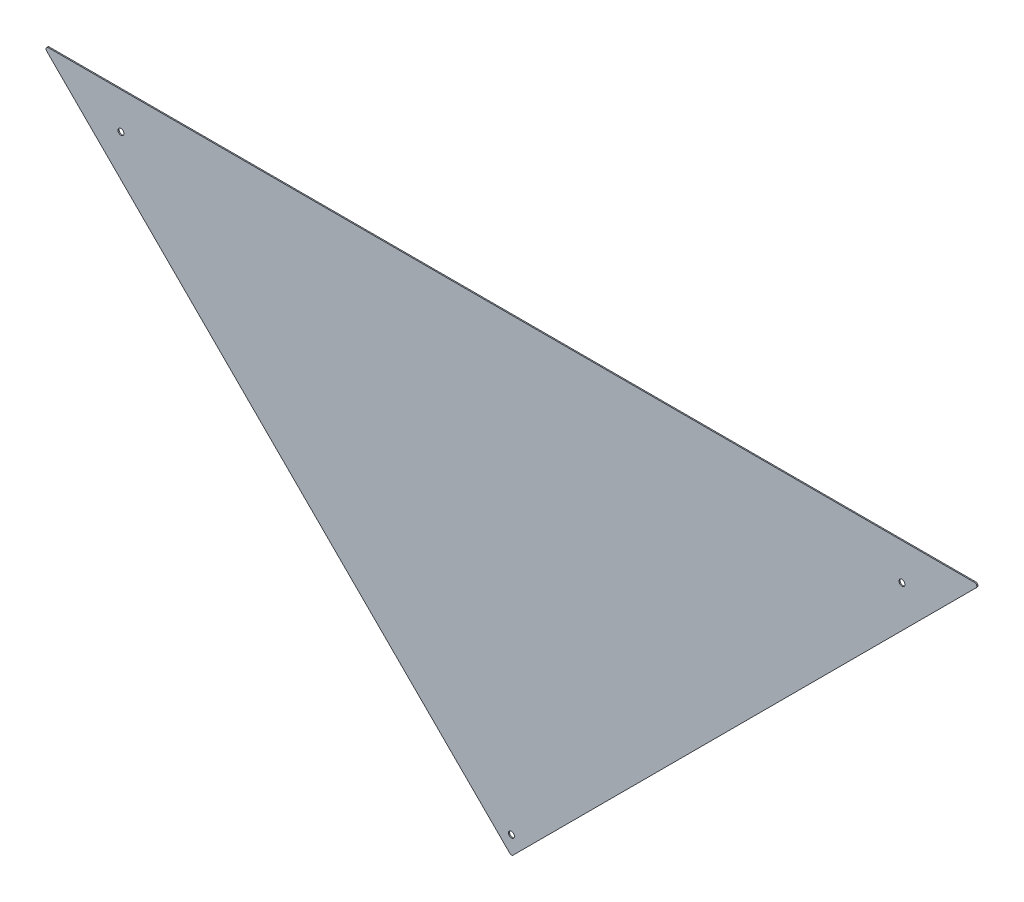
ISO-10303-21;
HEADER;
FILE_DESCRIPTION(('STEP AP214'),'2;1');
FILE_NAME('part.step','',(''),(''),'','','');
FILE_SCHEMA(('AUTOMOTIVE_DESIGN { 1 0 10303 214 1 1 1 1 }'));
ENDSEC;
DATA;
#1=APPLICATION_CONTEXT('core data for automotive mechanical design processes');
#2=APPLICATION_PROTOCOL_DEFINITION('international standard','automotive_design',2000,#1);
#3=PRODUCT_CONTEXT('',#1,'mechanical');
#4=PRODUCT('Part','Part','',(#3));
#5=PRODUCT_RELATED_PRODUCT_CATEGORY('part','',(#4));
#6=PRODUCT_DEFINITION_FORMATION('','',#4);
#7=PRODUCT_DEFINITION_CONTEXT('part definition',#1,'design');
#8=PRODUCT_DEFINITION('design','',#6,#7);
#9=PRODUCT_DEFINITION_SHAPE('','',#8);
#10=(LENGTH_UNIT() NAMED_UNIT(*) SI_UNIT(.MILLI.,.METRE.));
#11=(NAMED_UNIT(*) PLANE_ANGLE_UNIT() SI_UNIT($,.RADIAN.));
#12=(NAMED_UNIT(*) SI_UNIT($,.STERADIAN.) SOLID_ANGLE_UNIT());
#13=UNCERTAINTY_MEASURE_WITH_UNIT(LENGTH_MEASURE(1.E-05),#10,'distance_accuracy_value','');
#14=(GEOMETRIC_REPRESENTATION_CONTEXT(3) GLOBAL_UNCERTAINTY_ASSIGNED_CONTEXT((#13)) GLOBAL_UNIT_ASSIGNED_CONTEXT((#10,
#11,#12)) REPRESENTATION_CONTEXT('',''));
#15=CARTESIAN_POINT('',(0.,0.,0.));
#16=DIRECTION('',(0.,0.,1.));
#17=DIRECTION('',(1.,0.,0.));
#18=AXIS2_PLACEMENT_3D('',#15,#16,#17);
#19=CARTESIAN_POINT('',(0.,0.,0.));
#20=DIRECTION('',(0.,0.,1.));
#21=DIRECTION('',(1.,0.,0.));
#22=AXIS2_PLACEMENT_3D('',#19,#20,#21);
#23=PLANE('',#22);
#24=DIRECTION('',(-0.707106781186548,0.707106781186547,0.));
#25=VECTOR('',#24,1.);
#26=CARTESIAN_POINT('',(2.12132034355968,2.12132034355968,0.));
#27=LINE('',#26,#25);
#28=CARTESIAN_POINT('',(-2.12132034355,6.36396103066937,0.));
#29=VERTEX_POINT('',#28);
#30=CARTESIAN_POINT('',(-624.878679656431,629.12132034355,0.));
#31=VERTEX_POINT('',#30);
#32=EDGE_CURVE('E115',#29,#31,#27,.T.);
#33=ORIENTED_EDGE('',*,*,#32,.T.);
#34=CARTESIAN_POINT('',(-622.757359312871,631.24264068711,0.));
#35=DIRECTION('',(0.,0.,1.));
#36=DIRECTION('',(1.,0.,0.));
#37=AXIS2_PLACEMENT_3D('',#34,#35,#36);
#38=CIRCLE('',#37,3.);
#39=CARTESIAN_POINT('',(-622.757359312871,634.24264068711,0.));
#40=VERTEX_POINT('',#39);
#41=EDGE_CURVE('E45',#31,#40,#38,.F.);
#42=ORIENTED_EDGE('',*,*,#41,.T.);
#43=DIRECTION('',(-1.,0.,0.));
#44=VECTOR('',#43,1.);
#45=CARTESIAN_POINT('',(-629.99999999999,634.24264068711,0.));
#46=LINE('',#45,#44);
#47=CARTESIAN_POINT('',(622.75735931289,634.24264068711,0.));
#48=VERTEX_POINT('',#47);
#49=EDGE_CURVE('E142',#48,#40,#46,.T.);
#50=ORIENTED_EDGE('',*,*,#49,.F.);
#51=CARTESIAN_POINT('',(622.75735931289,631.24264068711,0.));
#52=DIRECTION('',(0.,0.,1.));
#53=DIRECTION('',(1.,0.,0.));
#54=AXIS2_PLACEMENT_3D('',#51,#52,#53);
#55=CIRCLE('',#54,3.);
#56=CARTESIAN_POINT('',(624.87867965645,629.12132034355,0.));
#57=VERTEX_POINT('',#56);
#58=EDGE_CURVE('E52',#48,#57,#55,.F.);
#59=ORIENTED_EDGE('',*,*,#58,.T.);
#60=DIRECTION('',(-0.707106781186547,-0.707106781186548,0.));
#61=VECTOR('',#60,1.);
#62=CARTESIAN_POINT('',(-2.12132034355001,2.12132034355001,0.));
#63=LINE('',#62,#61);
#64=CARTESIAN_POINT('',(2.12132034356932,6.36396103066933,0.));
#65=VERTEX_POINT('',#64);
#66=EDGE_CURVE('E116',#57,#65,#63,.T.);
#67=ORIENTED_EDGE('',*,*,#66,.T.);
#68=CARTESIAN_POINT('',(9.65894031423886E-12,8.48528137422899,0.));
#69=DIRECTION('',(0.,0.,-1.));
#70=DIRECTION('',(-1.,0.,0.));
#71=AXIS2_PLACEMENT_3D('',#68,#69,#70);
#72=CIRCLE('',#71,2.99999999999999);
#73=EDGE_CURVE('E123',#29,#65,#72,.F.);
#74=ORIENTED_EDGE('',*,*,#73,.F.);
#75=EDGE_LOOP('',(#33,#42,#50,#59,#67,#74));
#76=FACE_BOUND('',#75,.T.);
#77=CARTESIAN_POINT('',(-525.000000000019,585.,0.));
#78=DIRECTION('',(0.,0.,-1.));
#79=DIRECTION('',(-1.,0.,0.));
#80=AXIS2_PLACEMENT_3D('',#77,#78,#79);
#81=CIRCLE('',#80,4.);
#82=CARTESIAN_POINT('',(-529.000000000019,585.,0.));
#83=VERTEX_POINT('',#82);
#84=EDGE_CURVE('E133',#83,#83,#81,.F.);
#85=ORIENTED_EDGE('',*,*,#84,.T.);
#86=EDGE_LOOP('',(#85));
#87=FACE_BOUND('',#86,.T.);
#88=CARTESIAN_POINT('',(525.000000000019,585.000000000001,0.));
#89=DIRECTION('',(0.,0.,-1.));
#90=DIRECTION('',(-1.,0.,0.));
#91=AXIS2_PLACEMENT_3D('',#88,#89,#90);
#92=CIRCLE('',#91,4.);
#93=CARTESIAN_POINT('',(521.000000000019,585.000000000001,0.));
#94=VERTEX_POINT('',#93);
#95=EDGE_CURVE('E136',#94,#94,#92,.F.);
#96=ORIENTED_EDGE('',*,*,#95,.T.);
#97=EDGE_LOOP('',(#96));
#98=FACE_BOUND('',#97,.T.);
#99=CARTESIAN_POINT('',(-2.49800180540661E-13,29.2426406871193,0.));
#100=DIRECTION('',(0.,0.,-1.));
#101=DIRECTION('',(-1.,0.,0.));
#102=AXIS2_PLACEMENT_3D('',#99,#100,#101);
#103=CIRCLE('',#102,4.);
#104=CARTESIAN_POINT('',(-4.00000000000025,29.2426406871193,0.));
#105=VERTEX_POINT('',#104);
#106=EDGE_CURVE('E139',#105,#105,#103,.F.);
#107=ORIENTED_EDGE('',*,*,#106,.T.);
#108=EDGE_LOOP('',(#107));
#109=FACE_BOUND('',#108,.T.);
#110=ADVANCED_FACE('F37',(#76,#87,#98,#109),#23,.F.);
#111=CARTESIAN_POINT('',(-2.49800180540661E-13,29.2426406871193,1.50000000000006));
#112=DIRECTION('',(0.,0.,-1.));
#113=DIRECTION('',(-1.,0.,0.));
#114=AXIS2_PLACEMENT_3D('',#111,#112,#113);
#115=CYLINDRICAL_SURFACE('',#114,4.);
#116=CARTESIAN_POINT('',(-2.49800180540661E-13,29.2426406871193,1.50000000000006));
#117=DIRECTION('',(0.,0.,-1.));
#118=DIRECTION('',(-1.,0.,0.));
#119=AXIS2_PLACEMENT_3D('',#116,#117,#118);
#120=CIRCLE('',#119,4.);
#121=CARTESIAN_POINT('',(-4.00000000000025,29.2426406871193,1.50000000000006));
#122=VERTEX_POINT('',#121);
#123=EDGE_CURVE('E118',#122,#122,#120,.T.);
#124=ORIENTED_EDGE('',*,*,#123,.F.);
#125=EDGE_LOOP('',(#124));
#126=FACE_BOUND('',#125,.T.);
#127=ORIENTED_EDGE('',*,*,#106,.F.);
#128=EDGE_LOOP('',(#127));
#129=FACE_BOUND('',#128,.T.);
#130=ADVANCED_FACE('F191',(#126,#129),#115,.F.);
#131=CARTESIAN_POINT('',(525.000000000019,585.000000000001,1.50000000000006));
#132=DIRECTION('',(0.,0.,-1.));
#133=DIRECTION('',(-1.,0.,0.));
#134=AXIS2_PLACEMENT_3D('',#131,#132,#133);
#135=CYLINDRICAL_SURFACE('',#134,4.);
#136=CARTESIAN_POINT('',(525.000000000019,585.000000000001,1.50000000000006));
#137=DIRECTION('',(0.,0.,-1.));
#138=DIRECTION('',(-1.,0.,0.));
#139=AXIS2_PLACEMENT_3D('',#136,#137,#138);
#140=CIRCLE('',#139,4.);
#141=CARTESIAN_POINT('',(521.000000000019,585.000000000001,1.50000000000006));
#142=VERTEX_POINT('',#141);
#143=EDGE_CURVE('E127',#142,#142,#140,.T.);
#144=ORIENTED_EDGE('',*,*,#143,.F.);
#145=EDGE_LOOP('',(#144));
#146=FACE_BOUND('',#145,.T.);
#147=ORIENTED_EDGE('',*,*,#95,.F.);
#148=EDGE_LOOP('',(#147));
#149=FACE_BOUND('',#148,.T.);
#150=ADVANCED_FACE('F187',(#146,#149),#135,.F.);
#151=CARTESIAN_POINT('',(-525.000000000019,585.,1.50000000000006));
#152=DIRECTION('',(0.,0.,-1.));
#153=DIRECTION('',(-1.,0.,0.));
#154=AXIS2_PLACEMENT_3D('',#151,#152,#153);
#155=CYLINDRICAL_SURFACE('',#154,4.);
#156=CARTESIAN_POINT('',(-525.000000000019,585.,1.50000000000006));
#157=DIRECTION('',(0.,0.,-1.));
#158=DIRECTION('',(-1.,0.,0.));
#159=AXIS2_PLACEMENT_3D('',#156,#157,#158);
#160=CIRCLE('',#159,4.);
#161=CARTESIAN_POINT('',(-529.000000000019,585.,1.50000000000006));
#162=VERTEX_POINT('',#161);
#163=EDGE_CURVE('E112',#162,#162,#160,.T.);
#164=ORIENTED_EDGE('',*,*,#163,.F.);
#165=EDGE_LOOP('',(#164));
#166=FACE_BOUND('',#165,.T.);
#167=ORIENTED_EDGE('',*,*,#84,.F.);
#168=EDGE_LOOP('',(#167));
#169=FACE_BOUND('',#168,.T.);
#170=ADVANCED_FACE('F184',(#166,#169),#155,.F.);
#171=CARTESIAN_POINT('',(9.65894031423886E-12,8.48528137422899,1.50000000000006));
#172=DIRECTION('',(0.,0.,-1.));
#173=DIRECTION('',(-1.,0.,0.));
#174=AXIS2_PLACEMENT_3D('',#171,#172,#173);
#175=CYLINDRICAL_SURFACE('',#174,2.99999999999999);
#176=CARTESIAN_POINT('',(9.65894031423886E-12,8.48528137422899,1.50000000000006));
#177=DIRECTION('',(0.,0.,-1.));
#178=DIRECTION('',(-1.,0.,0.));
#179=AXIS2_PLACEMENT_3D('',#176,#177,#178);
#180=CIRCLE('',#179,2.99999999999999);
#181=CARTESIAN_POINT('',(-2.12132034355002,6.36396103066935,1.50000000000006));
#182=VERTEX_POINT('',#181);
#183=CARTESIAN_POINT('',(2.12132034356932,6.36396103066933,1.50000000000006));
#184=VERTEX_POINT('',#183);
#185=EDGE_CURVE('E98',#182,#184,#180,.F.);
#186=ORIENTED_EDGE('',*,*,#185,.F.);
#187=DIRECTION('',(0.,0.,1.));
#188=VECTOR('',#187,1.);
#189=CARTESIAN_POINT('',(-2.12132034355002,6.36396103066939,1.50000000000006));
#190=LINE('',#189,#188);
#191=EDGE_CURVE('E108',#182,#29,#190,.F.);
#192=ORIENTED_EDGE('',*,*,#191,.T.);
#193=ORIENTED_EDGE('',*,*,#73,.T.);
#194=DIRECTION('',(0.,0.,1.));
#195=VECTOR('',#194,1.);
#196=CARTESIAN_POINT('',(2.12132034356932,6.36396103066933,1.50000000000006));
#197=LINE('',#196,#195);
#198=EDGE_CURVE('E110',#65,#184,#197,.T.);
#199=ORIENTED_EDGE('',*,*,#198,.T.);
#200=EDGE_LOOP('',(#186,#192,#193,#199));
#201=FACE_BOUND('',#200,.T.);
#202=ADVANCED_FACE('F106',(#201),#175,.T.);
#203=CARTESIAN_POINT('',(-2.12132034355001,2.12132034355001,1.50000000000006));
#204=DIRECTION('',(-0.707106781186548,0.707106781186547,0.));
#205=DIRECTION('',(-0.707106781186547,-0.707106781186548,0.));
#206=AXIS2_PLACEMENT_3D('',#203,#204,#205);
#207=PLANE('',#206);
#208=ORIENTED_EDGE('',*,*,#66,.F.);
#209=DIRECTION('',(0.,0.,1.));
#210=VECTOR('',#209,1.);
#211=CARTESIAN_POINT('',(624.87867965645,629.12132034355,1.50000000000006));
#212=LINE('',#211,#210);
#213=CARTESIAN_POINT('',(624.87867965645,629.12132034355,1.50000000000006));
#214=VERTEX_POINT('',#213);
#215=EDGE_CURVE('E11',#57,#214,#212,.T.);
#216=ORIENTED_EDGE('',*,*,#215,.T.);
#217=DIRECTION('',(0.707106781186547,0.707106781186548,0.));
#218=VECTOR('',#217,1.);
#219=CARTESIAN_POINT('',(2.12132034356932,6.36396103066933,1.50000000000006));
#220=LINE('',#219,#218);
#221=EDGE_CURVE('E102',#184,#214,#220,.T.);
#222=ORIENTED_EDGE('',*,*,#221,.F.);
#223=ORIENTED_EDGE('',*,*,#198,.F.);
#224=EDGE_LOOP('',(#208,#216,#222,#223));
#225=FACE_BOUND('',#224,.T.);
#226=ADVANCED_FACE('F176',(#225),#207,.F.);
#227=CARTESIAN_POINT('',(2.12132034355968,2.12132034355968,1.50000000000006));
#228=DIRECTION('',(0.707106781186547,0.707106781186548,0.));
#229=DIRECTION('',(-0.707106781186548,0.707106781186547,0.));
#230=AXIS2_PLACEMENT_3D('',#227,#228,#229);
#231=PLANE('',#230);
#232=DIRECTION('',(0.707106781186548,-0.707106781186547,0.));
#233=VECTOR('',#232,1.);
#234=CARTESIAN_POINT('',(-594.878679656431,599.12132034355,1.50000000000006));
#235=LINE('',#234,#233);
#236=CARTESIAN_POINT('',(-624.878679656431,629.12132034355,1.50000000000006));
#237=VERTEX_POINT('',#236);
#238=EDGE_CURVE('E92',#237,#182,#235,.T.);
#239=ORIENTED_EDGE('',*,*,#238,.F.);
#240=DIRECTION('',(0.,0.,1.));
#241=VECTOR('',#240,1.);
#242=CARTESIAN_POINT('',(-624.878679656431,629.12132034355,0.));
#243=LINE('',#242,#241);
#244=EDGE_CURVE('E60',#237,#31,#243,.F.);
#245=ORIENTED_EDGE('',*,*,#244,.T.);
#246=ORIENTED_EDGE('',*,*,#32,.F.);
#247=ORIENTED_EDGE('',*,*,#191,.F.);
#248=EDGE_LOOP('',(#239,#245,#246,#247));
#249=FACE_BOUND('',#248,.T.);
#250=ADVANCED_FACE('F114',(#249),#231,.F.);
#251=CARTESIAN_POINT('',(0.,0.,1.50000000000006));
#252=DIRECTION('',(0.,0.,1.));
#253=DIRECTION('',(1.,0.,0.));
#254=AXIS2_PLACEMENT_3D('',#251,#252,#253);
#255=PLANE('',#254);
#256=DIRECTION('',(-1.,0.,0.));
#257=VECTOR('',#256,1.);
#258=CARTESIAN_POINT('',(-629.99999999999,634.24264068711,1.50000000000006));
#259=LINE('',#258,#257);
#260=CARTESIAN_POINT('',(622.75735931289,634.24264068711,1.50000000000006));
#261=VERTEX_POINT('',#260);
#262=CARTESIAN_POINT('',(-622.757359312871,634.24264068711,1.50000000000006));
#263=VERTEX_POINT('',#262);
#264=EDGE_CURVE('E160',#261,#263,#259,.T.);
#265=ORIENTED_EDGE('',*,*,#264,.T.);
#266=CARTESIAN_POINT('',(-622.757359312871,631.24264068711,1.50000000000006));
#267=DIRECTION('',(0.,0.,1.));
#268=DIRECTION('',(1.,0.,0.));
#269=AXIS2_PLACEMENT_3D('',#266,#267,#268);
#270=CIRCLE('',#269,3.);
#271=EDGE_CURVE('E99',#263,#237,#270,.T.);
#272=ORIENTED_EDGE('',*,*,#271,.T.);
#273=ORIENTED_EDGE('',*,*,#238,.T.);
#274=ORIENTED_EDGE('',*,*,#185,.T.);
#275=ORIENTED_EDGE('',*,*,#221,.T.);
#276=CARTESIAN_POINT('',(622.75735931289,631.24264068711,1.50000000000006));
#277=DIRECTION('',(0.,0.,1.));
#278=DIRECTION('',(1.,0.,0.));
#279=AXIS2_PLACEMENT_3D('',#276,#277,#278);
#280=CIRCLE('',#279,3.);
#281=EDGE_CURVE('E147',#214,#261,#280,.T.);
#282=ORIENTED_EDGE('',*,*,#281,.T.);
#283=EDGE_LOOP('',(#265,#272,#273,#274,#275,#282));
#284=FACE_BOUND('',#283,.T.);
#285=ORIENTED_EDGE('',*,*,#163,.T.);
#286=EDGE_LOOP('',(#285));
#287=FACE_BOUND('',#286,.T.);
#288=ORIENTED_EDGE('',*,*,#143,.T.);
#289=EDGE_LOOP('',(#288));
#290=FACE_BOUND('',#289,.T.);
#291=ORIENTED_EDGE('',*,*,#123,.T.);
#292=EDGE_LOOP('',(#291));
#293=FACE_BOUND('',#292,.T.);
#294=ADVANCED_FACE('F95',(#284,#287,#290,#293),#255,.T.);
#295=CARTESIAN_POINT('',(-629.99999999999,634.24264068711,0.));
#296=DIRECTION('',(0.,1.,0.));
#297=DIRECTION('',(0.,0.,1.));
#298=AXIS2_PLACEMENT_3D('',#295,#296,#297);
#299=PLANE('',#298);
#300=ORIENTED_EDGE('',*,*,#49,.T.);
#301=DIRECTION('',(0.,0.,1.));
#302=VECTOR('',#301,1.);
#303=CARTESIAN_POINT('',(-622.757359312871,634.24264068711,1.50000000000006));
#304=LINE('',#303,#302);
#305=EDGE_CURVE('E144',#40,#263,#304,.T.);
#306=ORIENTED_EDGE('',*,*,#305,.T.);
#307=ORIENTED_EDGE('',*,*,#264,.F.);
#308=DIRECTION('',(0.,0.,1.));
#309=VECTOR('',#308,1.);
#310=CARTESIAN_POINT('',(622.75735931289,634.24264068711,0.));
#311=LINE('',#310,#309);
#312=EDGE_CURVE('E101',#261,#48,#311,.F.);
#313=ORIENTED_EDGE('',*,*,#312,.T.);
#314=EDGE_LOOP('',(#300,#306,#307,#313));
#315=FACE_BOUND('',#314,.T.);
#316=ADVANCED_FACE('F157',(#315),#299,.T.);
#317=CARTESIAN_POINT('',(-622.757359312871,631.24264068711,0.));
#318=DIRECTION('',(0.,0.,-1.));
#319=DIRECTION('',(-1.,0.,0.));
#320=AXIS2_PLACEMENT_3D('',#317,#318,#319);
#321=CYLINDRICAL_SURFACE('',#320,3.);
#322=ORIENTED_EDGE('',*,*,#41,.F.);
#323=ORIENTED_EDGE('',*,*,#244,.F.);
#324=ORIENTED_EDGE('',*,*,#271,.F.);
#325=ORIENTED_EDGE('',*,*,#305,.F.);
#326=EDGE_LOOP('',(#322,#323,#324,#325));
#327=FACE_BOUND('',#326,.T.);
#328=ADVANCED_FACE('F162',(#327),#321,.T.);
#329=CARTESIAN_POINT('',(622.75735931289,631.24264068711,1.50000000000006));
#330=DIRECTION('',(0.,0.,-1.));
#331=DIRECTION('',(-1.,0.,0.));
#332=AXIS2_PLACEMENT_3D('',#329,#330,#331);
#333=CYLINDRICAL_SURFACE('',#332,3.);
#334=ORIENTED_EDGE('',*,*,#58,.F.);
#335=ORIENTED_EDGE('',*,*,#312,.F.);
#336=ORIENTED_EDGE('',*,*,#281,.F.);
#337=ORIENTED_EDGE('',*,*,#215,.F.);
#338=EDGE_LOOP('',(#334,#335,#336,#337));
#339=FACE_BOUND('',#338,.T.);
#340=ADVANCED_FACE('F39',(#339),#333,.T.);
#341=CLOSED_SHELL('',(#110,#130,#150,#170,#202,#226,#250,#294,#316,#328,#340));
#342=MANIFOLD_SOLID_BREP('B2',#341);
#343=ADVANCED_BREP_SHAPE_REPRESENTATION('',(#18,#342),#14);
#344=SHAPE_DEFINITION_REPRESENTATION(#9,#343);
ENDSEC;
END-ISO-10303-21;
